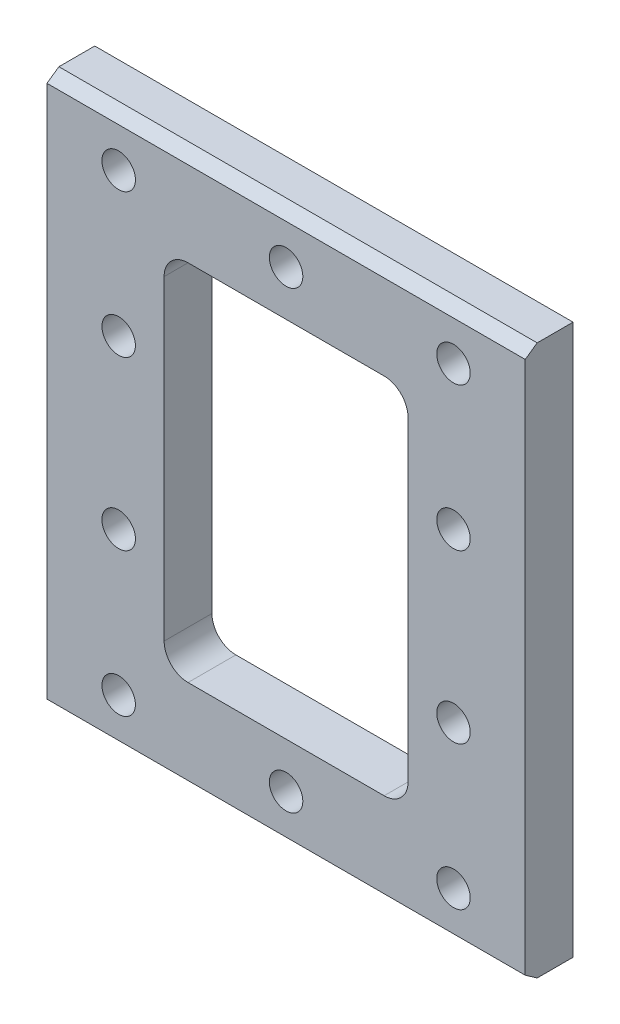
ISO-10303-21;
HEADER;
FILE_DESCRIPTION(('STEP AP214'),'2;1');
FILE_NAME('part.step','',(''),(''),'','','');
FILE_SCHEMA(('AUTOMOTIVE_DESIGN { 1 0 10303 214 1 1 1 1 }'));
ENDSEC;
DATA;
#1=APPLICATION_CONTEXT('core data for automotive mechanical design processes');
#2=APPLICATION_PROTOCOL_DEFINITION('international standard','automotive_design',2000,#1);
#3=PRODUCT_CONTEXT('',#1,'mechanical');
#4=PRODUCT('Part','Part','',(#3));
#5=PRODUCT_RELATED_PRODUCT_CATEGORY('part','',(#4));
#6=PRODUCT_DEFINITION_FORMATION('','',#4);
#7=PRODUCT_DEFINITION_CONTEXT('part definition',#1,'design');
#8=PRODUCT_DEFINITION('design','',#6,#7);
#9=PRODUCT_DEFINITION_SHAPE('','',#8);
#10=(LENGTH_UNIT() NAMED_UNIT(*) SI_UNIT(.MILLI.,.METRE.));
#11=(NAMED_UNIT(*) PLANE_ANGLE_UNIT() SI_UNIT($,.RADIAN.));
#12=(NAMED_UNIT(*) SI_UNIT($,.STERADIAN.) SOLID_ANGLE_UNIT());
#13=UNCERTAINTY_MEASURE_WITH_UNIT(LENGTH_MEASURE(1.E-05),#10,'distance_accuracy_value','');
#14=(GEOMETRIC_REPRESENTATION_CONTEXT(3) GLOBAL_UNCERTAINTY_ASSIGNED_CONTEXT((#13)) GLOBAL_UNIT_ASSIGNED_CONTEXT((#10,
#11,#12)) REPRESENTATION_CONTEXT('',''));
#15=CARTESIAN_POINT('',(0.,0.,0.));
#16=DIRECTION('',(0.,0.,1.));
#17=DIRECTION('',(1.,0.,0.));
#18=AXIS2_PLACEMENT_3D('',#15,#16,#17);
#19=CARTESIAN_POINT('',(100.,115.,20.));
#20=DIRECTION('',(-1.,0.,0.));
#21=DIRECTION('',(0.,-1.,0.));
#22=AXIS2_PLACEMENT_3D('',#19,#20,#21);
#23=PLANE('',#22);
#24=DIRECTION('',(0.,1.,0.));
#25=VECTOR('',#24,1.);
#26=CARTESIAN_POINT('',(100.,115.,20.));
#27=LINE('',#26,#25);
#28=CARTESIAN_POINT('',(100.,-111.498962308951,20.));
#29=VERTEX_POINT('',#28);
#30=CARTESIAN_POINT('',(100.,111.498962308951,20.));
#31=VERTEX_POINT('',#30);
#32=EDGE_CURVE('E201',#29,#31,#27,.T.);
#33=ORIENTED_EDGE('',*,*,#32,.F.);
#34=DIRECTION('',(0.,-0.573576436351046,-0.819152044288992));
#35=VECTOR('',#34,1.);
#36=CARTESIAN_POINT('',(100.,-111.498962308951,20.));
#37=LINE('',#36,#35);
#38=CARTESIAN_POINT('',(100.,-115.,15.0000000000001));
#39=VERTEX_POINT('',#38);
#40=EDGE_CURVE('E234',#29,#39,#37,.T.);
#41=ORIENTED_EDGE('',*,*,#40,.T.);
#42=DIRECTION('',(0.,0.,-1.));
#43=VECTOR('',#42,1.);
#44=CARTESIAN_POINT('',(100.,-115.,20.));
#45=LINE('',#44,#43);
#46=CARTESIAN_POINT('',(100.,-115.,0.));
#47=VERTEX_POINT('',#46);
#48=EDGE_CURVE('E208',#39,#47,#45,.T.);
#49=ORIENTED_EDGE('',*,*,#48,.T.);
#50=DIRECTION('',(0.,1.,0.));
#51=VECTOR('',#50,1.);
#52=CARTESIAN_POINT('',(100.,115.,0.));
#53=LINE('',#52,#51);
#54=CARTESIAN_POINT('',(100.,115.,0.));
#55=VERTEX_POINT('',#54);
#56=EDGE_CURVE('E156',#47,#55,#53,.T.);
#57=ORIENTED_EDGE('',*,*,#56,.T.);
#58=DIRECTION('',(0.,0.,-1.));
#59=VECTOR('',#58,1.);
#60=CARTESIAN_POINT('',(100.,115.,20.));
#61=LINE('',#60,#59);
#62=CARTESIAN_POINT('',(100.,115.,15.0000000000001));
#63=VERTEX_POINT('',#62);
#64=EDGE_CURVE('E224',#63,#55,#61,.T.);
#65=ORIENTED_EDGE('',*,*,#64,.F.);
#66=DIRECTION('',(0.,-0.573576436351046,0.819152044288992));
#67=VECTOR('',#66,1.);
#68=CARTESIAN_POINT('',(100.,111.498962308951,20.));
#69=LINE('',#68,#67);
#70=EDGE_CURVE('E232',#63,#31,#69,.T.);
#71=ORIENTED_EDGE('',*,*,#70,.T.);
#72=EDGE_LOOP('',(#33,#41,#49,#57,#65,#71));
#73=FACE_BOUND('',#72,.T.);
#74=ADVANCED_FACE('F35',(#73),#23,.F.);
#75=CARTESIAN_POINT('',(-100.,115.,20.));
#76=DIRECTION('',(0.,-1.,0.));
#77=DIRECTION('',(0.,0.,-1.));
#78=AXIS2_PLACEMENT_3D('',#75,#76,#77);
#79=PLANE('',#78);
#80=DIRECTION('',(0.,0.,-1.));
#81=VECTOR('',#80,1.);
#82=CARTESIAN_POINT('',(-100.,115.,20.));
#83=LINE('',#82,#81);
#84=CARTESIAN_POINT('',(-100.,115.,15.0000000000001));
#85=VERTEX_POINT('',#84);
#86=CARTESIAN_POINT('',(-100.,115.,0.));
#87=VERTEX_POINT('',#86);
#88=EDGE_CURVE('E222',#85,#87,#83,.T.);
#89=ORIENTED_EDGE('',*,*,#88,.F.);
#90=DIRECTION('',(1.,0.,0.));
#91=VECTOR('',#90,1.);
#92=CARTESIAN_POINT('',(100.,115.,15.0000000000001));
#93=LINE('',#92,#91);
#94=EDGE_CURVE('E11',#85,#63,#93,.T.);
#95=ORIENTED_EDGE('',*,*,#94,.T.);
#96=ORIENTED_EDGE('',*,*,#64,.T.);
#97=DIRECTION('',(-1.,0.,0.));
#98=VECTOR('',#97,1.);
#99=CARTESIAN_POINT('',(-100.,115.,0.));
#100=LINE('',#99,#98);
#101=EDGE_CURVE('E211',#55,#87,#100,.T.);
#102=ORIENTED_EDGE('',*,*,#101,.T.);
#103=EDGE_LOOP('',(#89,#95,#96,#102));
#104=FACE_BOUND('',#103,.T.);
#105=ADVANCED_FACE('F257',(#104),#79,.F.);
#106=CARTESIAN_POINT('',(-100.,115.,20.));
#107=DIRECTION('',(1.,0.,0.));
#108=DIRECTION('',(0.,1.,0.));
#109=AXIS2_PLACEMENT_3D('',#106,#107,#108);
#110=PLANE('',#109);
#111=DIRECTION('',(0.,0.,-1.));
#112=VECTOR('',#111,1.);
#113=CARTESIAN_POINT('',(-100.,-115.,20.));
#114=LINE('',#113,#112);
#115=CARTESIAN_POINT('',(-100.,-115.,15.0000000000001));
#116=VERTEX_POINT('',#115);
#117=CARTESIAN_POINT('',(-100.,-115.,0.));
#118=VERTEX_POINT('',#117);
#119=EDGE_CURVE('E220',#116,#118,#114,.T.);
#120=ORIENTED_EDGE('',*,*,#119,.F.);
#121=DIRECTION('',(0.,0.573576436351046,0.819152044288992));
#122=VECTOR('',#121,1.);
#123=CARTESIAN_POINT('',(-100.,-111.498962308951,20.));
#124=LINE('',#123,#122);
#125=CARTESIAN_POINT('',(-100.,-111.498962308951,20.));
#126=VERTEX_POINT('',#125);
#127=EDGE_CURVE('E43',#116,#126,#124,.T.);
#128=ORIENTED_EDGE('',*,*,#127,.T.);
#129=DIRECTION('',(0.,-1.,0.));
#130=VECTOR('',#129,1.);
#131=CARTESIAN_POINT('',(-100.,115.,20.));
#132=LINE('',#131,#130);
#133=CARTESIAN_POINT('',(-100.,111.498962308951,20.));
#134=VERTEX_POINT('',#133);
#135=EDGE_CURVE('E204',#134,#126,#132,.T.);
#136=ORIENTED_EDGE('',*,*,#135,.F.);
#137=DIRECTION('',(0.,0.573576436351046,-0.819152044288992));
#138=VECTOR('',#137,1.);
#139=CARTESIAN_POINT('',(-100.,111.498962308951,20.));
#140=LINE('',#139,#138);
#141=EDGE_CURVE('E50',#134,#85,#140,.T.);
#142=ORIENTED_EDGE('',*,*,#141,.T.);
#143=ORIENTED_EDGE('',*,*,#88,.T.);
#144=DIRECTION('',(0.,-1.,0.));
#145=VECTOR('',#144,1.);
#146=CARTESIAN_POINT('',(-100.,115.,0.));
#147=LINE('',#146,#145);
#148=EDGE_CURVE('E214',#87,#118,#147,.T.);
#149=ORIENTED_EDGE('',*,*,#148,.T.);
#150=EDGE_LOOP('',(#120,#128,#136,#142,#143,#149));
#151=FACE_BOUND('',#150,.T.);
#152=ADVANCED_FACE('F238',(#151),#110,.F.);
#153=CARTESIAN_POINT('',(-100.,-115.,20.));
#154=DIRECTION('',(0.,1.,0.));
#155=DIRECTION('',(0.,0.,1.));
#156=AXIS2_PLACEMENT_3D('',#153,#154,#155);
#157=PLANE('',#156);
#158=ORIENTED_EDGE('',*,*,#48,.F.);
#159=DIRECTION('',(-1.,0.,0.));
#160=VECTOR('',#159,1.);
#161=CARTESIAN_POINT('',(-100.,-115.,15.0000000000001));
#162=LINE('',#161,#160);
#163=EDGE_CURVE('E58',#39,#116,#162,.T.);
#164=ORIENTED_EDGE('',*,*,#163,.T.);
#165=ORIENTED_EDGE('',*,*,#119,.T.);
#166=DIRECTION('',(1.,0.,0.));
#167=VECTOR('',#166,1.);
#168=CARTESIAN_POINT('',(-100.,-115.,0.));
#169=LINE('',#168,#167);
#170=EDGE_CURVE('E205',#118,#47,#169,.T.);
#171=ORIENTED_EDGE('',*,*,#170,.T.);
#172=EDGE_LOOP('',(#158,#164,#165,#171));
#173=FACE_BOUND('',#172,.T.);
#174=ADVANCED_FACE('F247',(#173),#157,.F.);
#175=CARTESIAN_POINT('',(0.,0.,20.));
#176=DIRECTION('',(0.,0.,1.));
#177=DIRECTION('',(1.,0.,0.));
#178=AXIS2_PLACEMENT_3D('',#175,#176,#177);
#179=PLANE('',#178);
#180=CARTESIAN_POINT('',(70.,35.,20.));
#181=DIRECTION('',(0.,0.,1.));
#182=DIRECTION('',(1.,0.,0.));
#183=AXIS2_PLACEMENT_3D('',#180,#181,#182);
#184=CIRCLE('',#183,7.);
#185=CARTESIAN_POINT('',(77.,35.,20.));
#186=VERTEX_POINT('',#185);
#187=EDGE_CURVE('E522',#186,#186,#184,.T.);
#188=ORIENTED_EDGE('',*,*,#187,.F.);
#189=EDGE_LOOP('',(#188));
#190=FACE_BOUND('',#189,.T.);
#191=CARTESIAN_POINT('',(-70.,35.,20.));
#192=DIRECTION('',(0.,0.,1.));
#193=DIRECTION('',(1.,0.,0.));
#194=AXIS2_PLACEMENT_3D('',#191,#192,#193);
#195=CIRCLE('',#194,7.);
#196=CARTESIAN_POINT('',(-63.,35.,20.));
#197=VERTEX_POINT('',#196);
#198=EDGE_CURVE('E516',#197,#197,#195,.T.);
#199=ORIENTED_EDGE('',*,*,#198,.F.);
#200=EDGE_LOOP('',(#199));
#201=FACE_BOUND('',#200,.T.);
#202=CARTESIAN_POINT('',(70.,95.,20.));
#203=DIRECTION('',(0.,0.,1.));
#204=DIRECTION('',(1.,0.,0.));
#205=AXIS2_PLACEMENT_3D('',#202,#203,#204);
#206=CIRCLE('',#205,7.);
#207=CARTESIAN_POINT('',(77.,95.,20.));
#208=VERTEX_POINT('',#207);
#209=EDGE_CURVE('E503',#208,#208,#206,.T.);
#210=ORIENTED_EDGE('',*,*,#209,.F.);
#211=EDGE_LOOP('',(#210));
#212=FACE_BOUND('',#211,.T.);
#213=CARTESIAN_POINT('',(0.,95.,20.));
#214=DIRECTION('',(0.,0.,1.));
#215=DIRECTION('',(1.,0.,0.));
#216=AXIS2_PLACEMENT_3D('',#213,#214,#215);
#217=CIRCLE('',#216,7.00000000000001);
#218=CARTESIAN_POINT('',(7.00000000000002,95.,20.));
#219=VERTEX_POINT('',#218);
#220=EDGE_CURVE('E508',#219,#219,#217,.T.);
#221=ORIENTED_EDGE('',*,*,#220,.F.);
#222=EDGE_LOOP('',(#221));
#223=FACE_BOUND('',#222,.T.);
#224=CARTESIAN_POINT('',(-70.,95.,20.));
#225=DIRECTION('',(0.,0.,1.));
#226=DIRECTION('',(1.,0.,0.));
#227=AXIS2_PLACEMENT_3D('',#224,#225,#226);
#228=CIRCLE('',#227,7.);
#229=CARTESIAN_POINT('',(-63.,95.,20.));
#230=VERTEX_POINT('',#229);
#231=EDGE_CURVE('E527',#230,#230,#228,.T.);
#232=ORIENTED_EDGE('',*,*,#231,.F.);
#233=EDGE_LOOP('',(#232));
#234=FACE_BOUND('',#233,.T.);
#235=CARTESIAN_POINT('',(70.,-95.,20.));
#236=DIRECTION('',(0.,0.,1.));
#237=DIRECTION('',(-1.,0.,0.));
#238=AXIS2_PLACEMENT_3D('',#235,#236,#237);
#239=CIRCLE('',#238,7.);
#240=CARTESIAN_POINT('',(63.,-95.,20.));
#241=VERTEX_POINT('',#240);
#242=EDGE_CURVE('E550',#241,#241,#239,.T.);
#243=ORIENTED_EDGE('',*,*,#242,.F.);
#244=EDGE_LOOP('',(#243));
#245=FACE_BOUND('',#244,.T.);
#246=CARTESIAN_POINT('',(70.,-35.,20.));
#247=DIRECTION('',(0.,0.,1.));
#248=DIRECTION('',(-1.,0.,0.));
#249=AXIS2_PLACEMENT_3D('',#246,#247,#248);
#250=CIRCLE('',#249,7.);
#251=CARTESIAN_POINT('',(63.,-35.,20.));
#252=VERTEX_POINT('',#251);
#253=EDGE_CURVE('E544',#252,#252,#250,.T.);
#254=ORIENTED_EDGE('',*,*,#253,.F.);
#255=EDGE_LOOP('',(#254));
#256=FACE_BOUND('',#255,.T.);
#257=CARTESIAN_POINT('',(-70.,-95.,20.));
#258=DIRECTION('',(0.,0.,1.));
#259=DIRECTION('',(-1.,0.,0.));
#260=AXIS2_PLACEMENT_3D('',#257,#258,#259);
#261=CIRCLE('',#260,7.);
#262=CARTESIAN_POINT('',(-77.,-95.,20.));
#263=VERTEX_POINT('',#262);
#264=EDGE_CURVE('E536',#263,#263,#261,.T.);
#265=ORIENTED_EDGE('',*,*,#264,.F.);
#266=EDGE_LOOP('',(#265));
#267=FACE_BOUND('',#266,.T.);
#268=CARTESIAN_POINT('',(0.,-95.,20.));
#269=DIRECTION('',(0.,0.,1.));
#270=DIRECTION('',(-1.,0.,0.));
#271=AXIS2_PLACEMENT_3D('',#268,#269,#270);
#272=CIRCLE('',#271,7.00000000000001);
#273=CARTESIAN_POINT('',(-6.99999999999997,-95.,20.));
#274=VERTEX_POINT('',#273);
#275=EDGE_CURVE('E543',#274,#274,#272,.T.);
#276=ORIENTED_EDGE('',*,*,#275,.F.);
#277=EDGE_LOOP('',(#276));
#278=FACE_BOUND('',#277,.T.);
#279=CARTESIAN_POINT('',(-70.,-35.,20.));
#280=DIRECTION('',(0.,0.,1.));
#281=DIRECTION('',(-1.,0.,0.));
#282=AXIS2_PLACEMENT_3D('',#279,#280,#281);
#283=CIRCLE('',#282,7.);
#284=CARTESIAN_POINT('',(-77.,-35.,20.));
#285=VERTEX_POINT('',#284);
#286=EDGE_CURVE('E555',#285,#285,#283,.T.);
#287=ORIENTED_EDGE('',*,*,#286,.F.);
#288=EDGE_LOOP('',(#287));
#289=FACE_BOUND('',#288,.T.);
#290=CARTESIAN_POINT('',(-41.,-66.,20.));
#291=DIRECTION('',(0.,0.,1.));
#292=DIRECTION('',(1.,0.,0.));
#293=AXIS2_PLACEMENT_3D('',#290,#291,#292);
#294=CIRCLE('',#293,10.);
#295=CARTESIAN_POINT('',(-51.,-65.9999999999999,20.));
#296=VERTEX_POINT('',#295);
#297=CARTESIAN_POINT('',(-40.9999999999999,-76.,20.));
#298=VERTEX_POINT('',#297);
#299=EDGE_CURVE('E143',#296,#298,#294,.T.);
#300=ORIENTED_EDGE('',*,*,#299,.F.);
#301=DIRECTION('',(0.,-1.,0.));
#302=VECTOR('',#301,1.);
#303=CARTESIAN_POINT('',(-51.,65.9999999999999,20.));
#304=LINE('',#303,#302);
#305=CARTESIAN_POINT('',(-51.,65.9999999999999,20.));
#306=VERTEX_POINT('',#305);
#307=EDGE_CURVE('E148',#306,#296,#304,.T.);
#308=ORIENTED_EDGE('',*,*,#307,.F.);
#309=CARTESIAN_POINT('',(-41.,66.,20.));
#310=DIRECTION('',(0.,0.,1.));
#311=DIRECTION('',(1.,0.,0.));
#312=AXIS2_PLACEMENT_3D('',#309,#310,#311);
#313=CIRCLE('',#312,10.);
#314=CARTESIAN_POINT('',(-40.9999999999999,76.,20.));
#315=VERTEX_POINT('',#314);
#316=EDGE_CURVE('E184',#315,#306,#313,.T.);
#317=ORIENTED_EDGE('',*,*,#316,.F.);
#318=DIRECTION('',(-1.,0.,0.));
#319=VECTOR('',#318,1.);
#320=CARTESIAN_POINT('',(-40.9999999999999,76.,20.));
#321=LINE('',#320,#319);
#322=CARTESIAN_POINT('',(40.9999999999999,76.,20.));
#323=VERTEX_POINT('',#322);
#324=EDGE_CURVE('E181',#323,#315,#321,.T.);
#325=ORIENTED_EDGE('',*,*,#324,.F.);
#326=CARTESIAN_POINT('',(41.,66.,20.));
#327=DIRECTION('',(0.,0.,1.));
#328=DIRECTION('',(-1.,0.,0.));
#329=AXIS2_PLACEMENT_3D('',#326,#327,#328);
#330=CIRCLE('',#329,10.);
#331=CARTESIAN_POINT('',(51.,65.9999999999999,20.));
#332=VERTEX_POINT('',#331);
#333=EDGE_CURVE('E178',#332,#323,#330,.T.);
#334=ORIENTED_EDGE('',*,*,#333,.F.);
#335=DIRECTION('',(0.,1.,0.));
#336=VECTOR('',#335,1.);
#337=CARTESIAN_POINT('',(51.,65.9999999999999,20.));
#338=LINE('',#337,#336);
#339=CARTESIAN_POINT('',(51.,-65.9999999999999,20.));
#340=VERTEX_POINT('',#339);
#341=EDGE_CURVE('E175',#340,#332,#338,.T.);
#342=ORIENTED_EDGE('',*,*,#341,.F.);
#343=CARTESIAN_POINT('',(41.,-66.,20.));
#344=DIRECTION('',(0.,0.,1.));
#345=DIRECTION('',(1.,0.,0.));
#346=AXIS2_PLACEMENT_3D('',#343,#344,#345);
#347=CIRCLE('',#346,10.);
#348=CARTESIAN_POINT('',(40.9999999999999,-76.,20.));
#349=VERTEX_POINT('',#348);
#350=EDGE_CURVE('E172',#349,#340,#347,.T.);
#351=ORIENTED_EDGE('',*,*,#350,.F.);
#352=DIRECTION('',(1.,0.,0.));
#353=VECTOR('',#352,1.);
#354=CARTESIAN_POINT('',(-40.9999999999999,-76.,20.));
#355=LINE('',#354,#353);
#356=EDGE_CURVE('E165',#298,#349,#355,.T.);
#357=ORIENTED_EDGE('',*,*,#356,.F.);
#358=EDGE_LOOP('',(#300,#308,#317,#325,#334,#342,#351,#357));
#359=FACE_BOUND('',#358,.T.);
#360=ORIENTED_EDGE('',*,*,#135,.T.);
#361=DIRECTION('',(1.,0.,0.));
#362=VECTOR('',#361,1.);
#363=CARTESIAN_POINT('',(100.,-111.498962308951,20.));
#364=LINE('',#363,#362);
#365=EDGE_CURVE('E229',#126,#29,#364,.T.);
#366=ORIENTED_EDGE('',*,*,#365,.T.);
#367=ORIENTED_EDGE('',*,*,#32,.T.);
#368=DIRECTION('',(-1.,0.,0.));
#369=VECTOR('',#368,1.);
#370=CARTESIAN_POINT('',(-100.,111.498962308951,20.));
#371=LINE('',#370,#369);
#372=EDGE_CURVE('E226',#31,#134,#371,.T.);
#373=ORIENTED_EDGE('',*,*,#372,.T.);
#374=EDGE_LOOP('',(#360,#366,#367,#373));
#375=FACE_BOUND('',#374,.T.);
#376=ADVANCED_FACE('F242',(#190,#201,#212,#223,#234,#245,#256,#267,#278,#289,#359,#375),#179,.T.);
#377=CARTESIAN_POINT('',(0.,0.,0.));
#378=DIRECTION('',(0.,0.,1.));
#379=DIRECTION('',(1.,0.,0.));
#380=AXIS2_PLACEMENT_3D('',#377,#378,#379);
#381=PLANE('',#380);
#382=CARTESIAN_POINT('',(70.,35.,0.));
#383=DIRECTION('',(0.,0.,1.));
#384=DIRECTION('',(1.,0.,0.));
#385=AXIS2_PLACEMENT_3D('',#382,#383,#384);
#386=CIRCLE('',#385,7.);
#387=CARTESIAN_POINT('',(77.,35.,0.));
#388=VERTEX_POINT('',#387);
#389=EDGE_CURVE('E519',#388,#388,#386,.F.);
#390=ORIENTED_EDGE('',*,*,#389,.F.);
#391=EDGE_LOOP('',(#390));
#392=FACE_BOUND('',#391,.T.);
#393=CARTESIAN_POINT('',(-70.,35.,0.));
#394=DIRECTION('',(0.,0.,1.));
#395=DIRECTION('',(1.,0.,0.));
#396=AXIS2_PLACEMENT_3D('',#393,#394,#395);
#397=CIRCLE('',#396,7.);
#398=CARTESIAN_POINT('',(-63.,35.,0.));
#399=VERTEX_POINT('',#398);
#400=EDGE_CURVE('E513',#399,#399,#397,.F.);
#401=ORIENTED_EDGE('',*,*,#400,.F.);
#402=EDGE_LOOP('',(#401));
#403=FACE_BOUND('',#402,.T.);
#404=CARTESIAN_POINT('',(70.,95.,0.));
#405=DIRECTION('',(0.,0.,1.));
#406=DIRECTION('',(1.,0.,0.));
#407=AXIS2_PLACEMENT_3D('',#404,#405,#406);
#408=CIRCLE('',#407,7.);
#409=CARTESIAN_POINT('',(77.,95.,0.));
#410=VERTEX_POINT('',#409);
#411=EDGE_CURVE('E506',#410,#410,#408,.F.);
#412=ORIENTED_EDGE('',*,*,#411,.F.);
#413=EDGE_LOOP('',(#412));
#414=FACE_BOUND('',#413,.T.);
#415=CARTESIAN_POINT('',(0.,95.,0.));
#416=DIRECTION('',(0.,0.,1.));
#417=DIRECTION('',(1.,0.,0.));
#418=AXIS2_PLACEMENT_3D('',#415,#416,#417);
#419=CIRCLE('',#418,7.00000000000001);
#420=CARTESIAN_POINT('',(7.00000000000002,95.,0.));
#421=VERTEX_POINT('',#420);
#422=EDGE_CURVE('E511',#421,#421,#419,.F.);
#423=ORIENTED_EDGE('',*,*,#422,.F.);
#424=EDGE_LOOP('',(#423));
#425=FACE_BOUND('',#424,.T.);
#426=CARTESIAN_POINT('',(-70.,95.,0.));
#427=DIRECTION('',(0.,0.,1.));
#428=DIRECTION('',(1.,0.,0.));
#429=AXIS2_PLACEMENT_3D('',#426,#427,#428);
#430=CIRCLE('',#429,7.);
#431=CARTESIAN_POINT('',(-63.,95.,0.));
#432=VERTEX_POINT('',#431);
#433=EDGE_CURVE('E530',#432,#432,#430,.F.);
#434=ORIENTED_EDGE('',*,*,#433,.F.);
#435=EDGE_LOOP('',(#434));
#436=FACE_BOUND('',#435,.T.);
#437=CARTESIAN_POINT('',(70.,-95.,0.));
#438=DIRECTION('',(0.,0.,1.));
#439=DIRECTION('',(1.,0.,0.));
#440=AXIS2_PLACEMENT_3D('',#437,#438,#439);
#441=CIRCLE('',#440,7.);
#442=CARTESIAN_POINT('',(77.0000000000001,-95.,0.));
#443=VERTEX_POINT('',#442);
#444=EDGE_CURVE('E547',#443,#443,#441,.F.);
#445=ORIENTED_EDGE('',*,*,#444,.F.);
#446=EDGE_LOOP('',(#445));
#447=FACE_BOUND('',#446,.T.);
#448=CARTESIAN_POINT('',(70.,-35.,0.));
#449=DIRECTION('',(0.,0.,1.));
#450=DIRECTION('',(1.,0.,0.));
#451=AXIS2_PLACEMENT_3D('',#448,#449,#450);
#452=CIRCLE('',#451,7.);
#453=CARTESIAN_POINT('',(77.,-35.,0.));
#454=VERTEX_POINT('',#453);
#455=EDGE_CURVE('E540',#454,#454,#452,.F.);
#456=ORIENTED_EDGE('',*,*,#455,.F.);
#457=EDGE_LOOP('',(#456));
#458=FACE_BOUND('',#457,.T.);
#459=CARTESIAN_POINT('',(-70.,-95.,0.));
#460=DIRECTION('',(0.,0.,1.));
#461=DIRECTION('',(1.,0.,0.));
#462=AXIS2_PLACEMENT_3D('',#459,#460,#461);
#463=CIRCLE('',#462,7.);
#464=CARTESIAN_POINT('',(-63.,-95.,0.));
#465=VERTEX_POINT('',#464);
#466=EDGE_CURVE('E539',#465,#465,#463,.F.);
#467=ORIENTED_EDGE('',*,*,#466,.F.);
#468=EDGE_LOOP('',(#467));
#469=FACE_BOUND('',#468,.T.);
#470=CARTESIAN_POINT('',(0.,-95.,0.));
#471=DIRECTION('',(0.,0.,1.));
#472=DIRECTION('',(1.,0.,0.));
#473=AXIS2_PLACEMENT_3D('',#470,#471,#472);
#474=CIRCLE('',#473,7.00000000000001);
#475=CARTESIAN_POINT('',(7.00000000000004,-95.,0.));
#476=VERTEX_POINT('',#475);
#477=EDGE_CURVE('E558',#476,#476,#474,.F.);
#478=ORIENTED_EDGE('',*,*,#477,.F.);
#479=EDGE_LOOP('',(#478));
#480=FACE_BOUND('',#479,.T.);
#481=CARTESIAN_POINT('',(-70.,-35.,0.));
#482=DIRECTION('',(0.,0.,1.));
#483=DIRECTION('',(1.,0.,0.));
#484=AXIS2_PLACEMENT_3D('',#481,#482,#483);
#485=CIRCLE('',#484,7.);
#486=CARTESIAN_POINT('',(-63.,-35.,0.));
#487=VERTEX_POINT('',#486);
#488=EDGE_CURVE('E524',#487,#487,#485,.F.);
#489=ORIENTED_EDGE('',*,*,#488,.F.);
#490=EDGE_LOOP('',(#489));
#491=FACE_BOUND('',#490,.T.);
#492=DIRECTION('',(0.,1.,0.));
#493=VECTOR('',#492,1.);
#494=CARTESIAN_POINT('',(-51.,65.9999999999999,0.));
#495=LINE('',#494,#493);
#496=CARTESIAN_POINT('',(-51.,-65.9999999999999,0.));
#497=VERTEX_POINT('',#496);
#498=CARTESIAN_POINT('',(-51.,65.9999999999999,0.));
#499=VERTEX_POINT('',#498);
#500=EDGE_CURVE('E163',#497,#499,#495,.T.);
#501=ORIENTED_EDGE('',*,*,#500,.F.);
#502=CARTESIAN_POINT('',(-41.,-66.,0.));
#503=DIRECTION('',(0.,0.,1.));
#504=DIRECTION('',(1.,0.,0.));
#505=AXIS2_PLACEMENT_3D('',#502,#503,#504);
#506=CIRCLE('',#505,10.);
#507=CARTESIAN_POINT('',(-40.9999999999999,-76.,0.));
#508=VERTEX_POINT('',#507);
#509=EDGE_CURVE('E140',#508,#497,#506,.F.);
#510=ORIENTED_EDGE('',*,*,#509,.F.);
#511=DIRECTION('',(-1.,0.,0.));
#512=VECTOR('',#511,1.);
#513=CARTESIAN_POINT('',(-40.9999999999999,-76.,0.));
#514=LINE('',#513,#512);
#515=CARTESIAN_POINT('',(40.9999999999999,-76.,0.));
#516=VERTEX_POINT('',#515);
#517=EDGE_CURVE('E152',#516,#508,#514,.T.);
#518=ORIENTED_EDGE('',*,*,#517,.F.);
#519=CARTESIAN_POINT('',(41.,-66.,0.));
#520=DIRECTION('',(0.,0.,1.));
#521=DIRECTION('',(1.,0.,0.));
#522=AXIS2_PLACEMENT_3D('',#519,#520,#521);
#523=CIRCLE('',#522,10.);
#524=CARTESIAN_POINT('',(51.,-65.9999999999999,0.));
#525=VERTEX_POINT('',#524);
#526=EDGE_CURVE('E532',#525,#516,#523,.F.);
#527=ORIENTED_EDGE('',*,*,#526,.F.);
#528=DIRECTION('',(0.,-1.,0.));
#529=VECTOR('',#528,1.);
#530=CARTESIAN_POINT('',(51.,65.9999999999999,0.));
#531=LINE('',#530,#529);
#532=CARTESIAN_POINT('',(51.,65.9999999999999,0.));
#533=VERTEX_POINT('',#532);
#534=EDGE_CURVE('E566',#533,#525,#531,.T.);
#535=ORIENTED_EDGE('',*,*,#534,.F.);
#536=CARTESIAN_POINT('',(41.,66.,0.));
#537=DIRECTION('',(0.,0.,1.));
#538=DIRECTION('',(1.,0.,0.));
#539=AXIS2_PLACEMENT_3D('',#536,#537,#538);
#540=CIRCLE('',#539,10.);
#541=CARTESIAN_POINT('',(40.9999999999999,76.,0.));
#542=VERTEX_POINT('',#541);
#543=EDGE_CURVE('E569',#542,#533,#540,.F.);
#544=ORIENTED_EDGE('',*,*,#543,.F.);
#545=DIRECTION('',(1.,0.,0.));
#546=VECTOR('',#545,1.);
#547=CARTESIAN_POINT('',(-40.9999999999999,76.,0.));
#548=LINE('',#547,#546);
#549=CARTESIAN_POINT('',(-40.9999999999999,76.,0.));
#550=VERTEX_POINT('',#549);
#551=EDGE_CURVE('E572',#550,#542,#548,.T.);
#552=ORIENTED_EDGE('',*,*,#551,.F.);
#553=CARTESIAN_POINT('',(-41.,66.,0.));
#554=DIRECTION('',(0.,0.,1.));
#555=DIRECTION('',(1.,0.,0.));
#556=AXIS2_PLACEMENT_3D('',#553,#554,#555);
#557=CIRCLE('',#556,10.);
#558=EDGE_CURVE('E167',#499,#550,#557,.F.);
#559=ORIENTED_EDGE('',*,*,#558,.F.);
#560=EDGE_LOOP('',(#501,#510,#518,#527,#535,#544,#552,#559));
#561=FACE_BOUND('',#560,.T.);
#562=ORIENTED_EDGE('',*,*,#56,.F.);
#563=ORIENTED_EDGE('',*,*,#170,.F.);
#564=ORIENTED_EDGE('',*,*,#148,.F.);
#565=ORIENTED_EDGE('',*,*,#101,.F.);
#566=EDGE_LOOP('',(#562,#563,#564,#565));
#567=FACE_BOUND('',#566,.T.);
#568=ADVANCED_FACE('F159',(#392,#403,#414,#425,#436,#447,#458,#469,#480,#491,#561,#567),#381,.F.);
#569=CARTESIAN_POINT('',(-41.,-66.,-0.001000000000001));
#570=DIRECTION('',(0.,0.,1.));
#571=DIRECTION('',(1.,0.,0.));
#572=AXIS2_PLACEMENT_3D('',#569,#570,#571);
#573=CYLINDRICAL_SURFACE('',#572,10.);
#574=ORIENTED_EDGE('',*,*,#509,.T.);
#575=DIRECTION('',(0.,0.,1.));
#576=VECTOR('',#575,1.);
#577=CARTESIAN_POINT('',(-51.,-65.9999999999999,-0.001000000000001));
#578=LINE('',#577,#576);
#579=EDGE_CURVE('E157',#497,#296,#578,.T.);
#580=ORIENTED_EDGE('',*,*,#579,.T.);
#581=ORIENTED_EDGE('',*,*,#299,.T.);
#582=DIRECTION('',(0.,0.,1.));
#583=VECTOR('',#582,1.);
#584=CARTESIAN_POINT('',(-40.9999999999999,-76.,-0.001000000000001));
#585=LINE('',#584,#583);
#586=EDGE_CURVE('E136',#508,#298,#585,.T.);
#587=ORIENTED_EDGE('',*,*,#586,.F.);
#588=EDGE_LOOP('',(#574,#580,#581,#587));
#589=FACE_BOUND('',#588,.T.);
#590=ADVANCED_FACE('F138',(#589),#573,.F.);
#591=CARTESIAN_POINT('',(-51.,65.9999999999999,-0.001000000000001));
#592=DIRECTION('',(-1.,0.,0.));
#593=DIRECTION('',(0.,-1.,0.));
#594=AXIS2_PLACEMENT_3D('',#591,#592,#593);
#595=PLANE('',#594);
#596=ORIENTED_EDGE('',*,*,#500,.T.);
#597=DIRECTION('',(0.,0.,1.));
#598=VECTOR('',#597,1.);
#599=CARTESIAN_POINT('',(-51.,65.9999999999999,-0.001000000000001));
#600=LINE('',#599,#598);
#601=EDGE_CURVE('E190',#499,#306,#600,.T.);
#602=ORIENTED_EDGE('',*,*,#601,.T.);
#603=ORIENTED_EDGE('',*,*,#307,.T.);
#604=ORIENTED_EDGE('',*,*,#579,.F.);
#605=EDGE_LOOP('',(#596,#602,#603,#604));
#606=FACE_BOUND('',#605,.T.);
#607=ADVANCED_FACE('F314',(#606),#595,.F.);
#608=CARTESIAN_POINT('',(-41.,66.,-0.001000000000001));
#609=DIRECTION('',(0.,0.,1.));
#610=DIRECTION('',(1.,0.,0.));
#611=AXIS2_PLACEMENT_3D('',#608,#609,#610);
#612=CYLINDRICAL_SURFACE('',#611,10.);
#613=ORIENTED_EDGE('',*,*,#558,.T.);
#614=DIRECTION('',(0.,0.,1.));
#615=VECTOR('',#614,1.);
#616=CARTESIAN_POINT('',(-40.9999999999999,76.,-0.001000000000001));
#617=LINE('',#616,#615);
#618=EDGE_CURVE('E192',#550,#315,#617,.T.);
#619=ORIENTED_EDGE('',*,*,#618,.T.);
#620=ORIENTED_EDGE('',*,*,#316,.T.);
#621=ORIENTED_EDGE('',*,*,#601,.F.);
#622=EDGE_LOOP('',(#613,#619,#620,#621));
#623=FACE_BOUND('',#622,.T.);
#624=ADVANCED_FACE('F317',(#623),#612,.F.);
#625=CARTESIAN_POINT('',(-40.9999999999999,76.,-0.001000000000001));
#626=DIRECTION('',(0.,1.,0.));
#627=DIRECTION('',(0.,0.,1.));
#628=AXIS2_PLACEMENT_3D('',#625,#626,#627);
#629=PLANE('',#628);
#630=ORIENTED_EDGE('',*,*,#551,.T.);
#631=DIRECTION('',(0.,0.,1.));
#632=VECTOR('',#631,1.);
#633=CARTESIAN_POINT('',(40.9999999999999,76.,-0.001000000000001));
#634=LINE('',#633,#632);
#635=EDGE_CURVE('E194',#542,#323,#634,.T.);
#636=ORIENTED_EDGE('',*,*,#635,.T.);
#637=ORIENTED_EDGE('',*,*,#324,.T.);
#638=ORIENTED_EDGE('',*,*,#618,.F.);
#639=EDGE_LOOP('',(#630,#636,#637,#638));
#640=FACE_BOUND('',#639,.T.);
#641=ADVANCED_FACE('F321',(#640),#629,.F.);
#642=CARTESIAN_POINT('',(41.,66.,-0.001000000000001));
#643=DIRECTION('',(0.,0.,1.));
#644=DIRECTION('',(1.,0.,0.));
#645=AXIS2_PLACEMENT_3D('',#642,#643,#644);
#646=CYLINDRICAL_SURFACE('',#645,10.);
#647=ORIENTED_EDGE('',*,*,#543,.T.);
#648=DIRECTION('',(0.,0.,1.));
#649=VECTOR('',#648,1.);
#650=CARTESIAN_POINT('',(51.,65.9999999999999,-0.001000000000001));
#651=LINE('',#650,#649);
#652=EDGE_CURVE('E196',#533,#332,#651,.T.);
#653=ORIENTED_EDGE('',*,*,#652,.T.);
#654=ORIENTED_EDGE('',*,*,#333,.T.);
#655=ORIENTED_EDGE('',*,*,#635,.F.);
#656=EDGE_LOOP('',(#647,#653,#654,#655));
#657=FACE_BOUND('',#656,.T.);
#658=ADVANCED_FACE('F325',(#657),#646,.F.);
#659=CARTESIAN_POINT('',(51.,65.9999999999999,-0.001000000000001));
#660=DIRECTION('',(1.,0.,0.));
#661=DIRECTION('',(0.,1.,0.));
#662=AXIS2_PLACEMENT_3D('',#659,#660,#661);
#663=PLANE('',#662);
#664=ORIENTED_EDGE('',*,*,#534,.T.);
#665=DIRECTION('',(0.,0.,1.));
#666=VECTOR('',#665,1.);
#667=CARTESIAN_POINT('',(51.,-65.9999999999999,-0.001000000000001));
#668=LINE('',#667,#666);
#669=EDGE_CURVE('E198',#525,#340,#668,.T.);
#670=ORIENTED_EDGE('',*,*,#669,.T.);
#671=ORIENTED_EDGE('',*,*,#341,.T.);
#672=ORIENTED_EDGE('',*,*,#652,.F.);
#673=EDGE_LOOP('',(#664,#670,#671,#672));
#674=FACE_BOUND('',#673,.T.);
#675=ADVANCED_FACE('F329',(#674),#663,.F.);
#676=CARTESIAN_POINT('',(41.,-66.,-0.001000000000001));
#677=DIRECTION('',(0.,0.,1.));
#678=DIRECTION('',(1.,0.,0.));
#679=AXIS2_PLACEMENT_3D('',#676,#677,#678);
#680=CYLINDRICAL_SURFACE('',#679,10.);
#681=ORIENTED_EDGE('',*,*,#526,.T.);
#682=DIRECTION('',(0.,0.,1.));
#683=VECTOR('',#682,1.);
#684=CARTESIAN_POINT('',(40.9999999999999,-76.,-0.001000000000001));
#685=LINE('',#684,#683);
#686=EDGE_CURVE('E147',#516,#349,#685,.T.);
#687=ORIENTED_EDGE('',*,*,#686,.T.);
#688=ORIENTED_EDGE('',*,*,#350,.T.);
#689=ORIENTED_EDGE('',*,*,#669,.F.);
#690=EDGE_LOOP('',(#681,#687,#688,#689));
#691=FACE_BOUND('',#690,.T.);
#692=ADVANCED_FACE('F333',(#691),#680,.F.);
#693=CARTESIAN_POINT('',(-40.9999999999999,-76.,-0.001000000000001));
#694=DIRECTION('',(0.,-1.,0.));
#695=DIRECTION('',(0.,0.,-1.));
#696=AXIS2_PLACEMENT_3D('',#693,#694,#695);
#697=PLANE('',#696);
#698=ORIENTED_EDGE('',*,*,#517,.T.);
#699=ORIENTED_EDGE('',*,*,#586,.T.);
#700=ORIENTED_EDGE('',*,*,#356,.T.);
#701=ORIENTED_EDGE('',*,*,#686,.F.);
#702=EDGE_LOOP('',(#698,#699,#700,#701));
#703=FACE_BOUND('',#702,.T.);
#704=ADVANCED_FACE('F153',(#703),#697,.F.);
#705=CARTESIAN_POINT('',(-70.,-35.,-0.001000000000001));
#706=DIRECTION('',(0.,0.,1.));
#707=DIRECTION('',(1.,0.,0.));
#708=AXIS2_PLACEMENT_3D('',#705,#706,#707);
#709=CYLINDRICAL_SURFACE('',#708,7.);
#710=ORIENTED_EDGE('',*,*,#286,.T.);
#711=EDGE_LOOP('',(#710));
#712=FACE_BOUND('',#711,.T.);
#713=ORIENTED_EDGE('',*,*,#488,.T.);
#714=EDGE_LOOP('',(#713));
#715=FACE_BOUND('',#714,.T.);
#716=ADVANCED_FACE('F307',(#712,#715),#709,.F.);
#717=CARTESIAN_POINT('',(0.,-95.,-0.001000000000001));
#718=DIRECTION('',(0.,0.,1.));
#719=DIRECTION('',(1.,0.,0.));
#720=AXIS2_PLACEMENT_3D('',#717,#718,#719);
#721=CYLINDRICAL_SURFACE('',#720,7.00000000000001);
#722=ORIENTED_EDGE('',*,*,#275,.T.);
#723=EDGE_LOOP('',(#722));
#724=FACE_BOUND('',#723,.T.);
#725=ORIENTED_EDGE('',*,*,#477,.T.);
#726=EDGE_LOOP('',(#725));
#727=FACE_BOUND('',#726,.T.);
#728=ADVANCED_FACE('F299',(#724,#727),#721,.F.);
#729=CARTESIAN_POINT('',(-70.,-95.,-0.001000000000001));
#730=DIRECTION('',(0.,0.,1.));
#731=DIRECTION('',(1.,0.,0.));
#732=AXIS2_PLACEMENT_3D('',#729,#730,#731);
#733=CYLINDRICAL_SURFACE('',#732,7.);
#734=ORIENTED_EDGE('',*,*,#264,.T.);
#735=EDGE_LOOP('',(#734));
#736=FACE_BOUND('',#735,.T.);
#737=ORIENTED_EDGE('',*,*,#466,.T.);
#738=EDGE_LOOP('',(#737));
#739=FACE_BOUND('',#738,.T.);
#740=ADVANCED_FACE('F295',(#736,#739),#733,.F.);
#741=CARTESIAN_POINT('',(70.,-35.,-0.001000000000001));
#742=DIRECTION('',(0.,0.,1.));
#743=DIRECTION('',(1.,0.,0.));
#744=AXIS2_PLACEMENT_3D('',#741,#742,#743);
#745=CYLINDRICAL_SURFACE('',#744,7.);
#746=ORIENTED_EDGE('',*,*,#253,.T.);
#747=EDGE_LOOP('',(#746));
#748=FACE_BOUND('',#747,.T.);
#749=ORIENTED_EDGE('',*,*,#455,.T.);
#750=EDGE_LOOP('',(#749));
#751=FACE_BOUND('',#750,.T.);
#752=ADVANCED_FACE('F298',(#748,#751),#745,.F.);
#753=CARTESIAN_POINT('',(70.,-95.,-0.001000000000001));
#754=DIRECTION('',(0.,0.,1.));
#755=DIRECTION('',(1.,0.,0.));
#756=AXIS2_PLACEMENT_3D('',#753,#754,#755);
#757=CYLINDRICAL_SURFACE('',#756,7.);
#758=ORIENTED_EDGE('',*,*,#242,.T.);
#759=EDGE_LOOP('',(#758));
#760=FACE_BOUND('',#759,.T.);
#761=ORIENTED_EDGE('',*,*,#444,.T.);
#762=EDGE_LOOP('',(#761));
#763=FACE_BOUND('',#762,.T.);
#764=ADVANCED_FACE('F290',(#760,#763),#757,.F.);
#765=CARTESIAN_POINT('',(-70.,95.,-0.001000000000001));
#766=DIRECTION('',(0.,0.,1.));
#767=DIRECTION('',(1.,0.,0.));
#768=AXIS2_PLACEMENT_3D('',#765,#766,#767);
#769=CYLINDRICAL_SURFACE('',#768,7.);
#770=ORIENTED_EDGE('',*,*,#231,.T.);
#771=EDGE_LOOP('',(#770));
#772=FACE_BOUND('',#771,.T.);
#773=ORIENTED_EDGE('',*,*,#433,.T.);
#774=EDGE_LOOP('',(#773));
#775=FACE_BOUND('',#774,.T.);
#776=ADVANCED_FACE('F286',(#772,#775),#769,.F.);
#777=CARTESIAN_POINT('',(0.,95.,-0.001000000000001));
#778=DIRECTION('',(0.,0.,1.));
#779=DIRECTION('',(1.,0.,0.));
#780=AXIS2_PLACEMENT_3D('',#777,#778,#779);
#781=CYLINDRICAL_SURFACE('',#780,7.00000000000001);
#782=ORIENTED_EDGE('',*,*,#220,.T.);
#783=EDGE_LOOP('',(#782));
#784=FACE_BOUND('',#783,.T.);
#785=ORIENTED_EDGE('',*,*,#422,.T.);
#786=EDGE_LOOP('',(#785));
#787=FACE_BOUND('',#786,.T.);
#788=ADVANCED_FACE('F289',(#784,#787),#781,.F.);
#789=CARTESIAN_POINT('',(70.,95.,-0.001000000000001));
#790=DIRECTION('',(0.,0.,1.));
#791=DIRECTION('',(1.,0.,0.));
#792=AXIS2_PLACEMENT_3D('',#789,#790,#791);
#793=CYLINDRICAL_SURFACE('',#792,7.);
#794=ORIENTED_EDGE('',*,*,#209,.T.);
#795=EDGE_LOOP('',(#794));
#796=FACE_BOUND('',#795,.T.);
#797=ORIENTED_EDGE('',*,*,#411,.T.);
#798=EDGE_LOOP('',(#797));
#799=FACE_BOUND('',#798,.T.);
#800=ADVANCED_FACE('F279',(#796,#799),#793,.F.);
#801=CARTESIAN_POINT('',(-70.,35.,-0.001000000000001));
#802=DIRECTION('',(0.,0.,1.));
#803=DIRECTION('',(1.,0.,0.));
#804=AXIS2_PLACEMENT_3D('',#801,#802,#803);
#805=CYLINDRICAL_SURFACE('',#804,7.);
#806=ORIENTED_EDGE('',*,*,#198,.T.);
#807=EDGE_LOOP('',(#806));
#808=FACE_BOUND('',#807,.T.);
#809=ORIENTED_EDGE('',*,*,#400,.T.);
#810=EDGE_LOOP('',(#809));
#811=FACE_BOUND('',#810,.T.);
#812=ADVANCED_FACE('F273',(#808,#811),#805,.F.);
#813=CARTESIAN_POINT('',(70.,35.,-0.001000000000001));
#814=DIRECTION('',(0.,0.,1.));
#815=DIRECTION('',(1.,0.,0.));
#816=AXIS2_PLACEMENT_3D('',#813,#814,#815);
#817=CYLINDRICAL_SURFACE('',#816,7.);
#818=ORIENTED_EDGE('',*,*,#187,.T.);
#819=EDGE_LOOP('',(#818));
#820=FACE_BOUND('',#819,.T.);
#821=ORIENTED_EDGE('',*,*,#389,.T.);
#822=EDGE_LOOP('',(#821));
#823=FACE_BOUND('',#822,.T.);
#824=ADVANCED_FACE('F268',(#820,#823),#817,.F.);
#825=CARTESIAN_POINT('',(0.,-111.498962308951,20.));
#826=DIRECTION('',(0.,-0.819152044288992,0.573576436351046));
#827=DIRECTION('',(-1.,0.,0.));
#828=AXIS2_PLACEMENT_3D('',#825,#826,#827);
#829=PLANE('',#828);
#830=ORIENTED_EDGE('',*,*,#127,.F.);
#831=ORIENTED_EDGE('',*,*,#163,.F.);
#832=ORIENTED_EDGE('',*,*,#40,.F.);
#833=ORIENTED_EDGE('',*,*,#365,.F.);
#834=EDGE_LOOP('',(#830,#831,#832,#833));
#835=FACE_BOUND('',#834,.T.);
#836=ADVANCED_FACE('F245',(#835),#829,.T.);
#837=CARTESIAN_POINT('',(0.,111.498962308951,20.));
#838=DIRECTION('',(0.,0.819152044288992,0.573576436351046));
#839=DIRECTION('',(1.,0.,0.));
#840=AXIS2_PLACEMENT_3D('',#837,#838,#839);
#841=PLANE('',#840);
#842=ORIENTED_EDGE('',*,*,#70,.F.);
#843=ORIENTED_EDGE('',*,*,#94,.F.);
#844=ORIENTED_EDGE('',*,*,#141,.F.);
#845=ORIENTED_EDGE('',*,*,#372,.F.);
#846=EDGE_LOOP('',(#842,#843,#844,#845));
#847=FACE_BOUND('',#846,.T.);
#848=ADVANCED_FACE('F37',(#847),#841,.T.);
#849=CLOSED_SHELL('',(#74,#105,#152,#174,#376,#568,#590,#607,#624,#641,#658,#675,#692,#704,#716,
#728,#740,#752,#764,#776,#788,#800,#812,#824,#836,#848));
#850=MANIFOLD_SOLID_BREP('B2',#849);
#851=ADVANCED_BREP_SHAPE_REPRESENTATION('',(#18,#850),#14);
#852=SHAPE_DEFINITION_REPRESENTATION(#9,#851);
ENDSEC;
END-ISO-10303-21;
